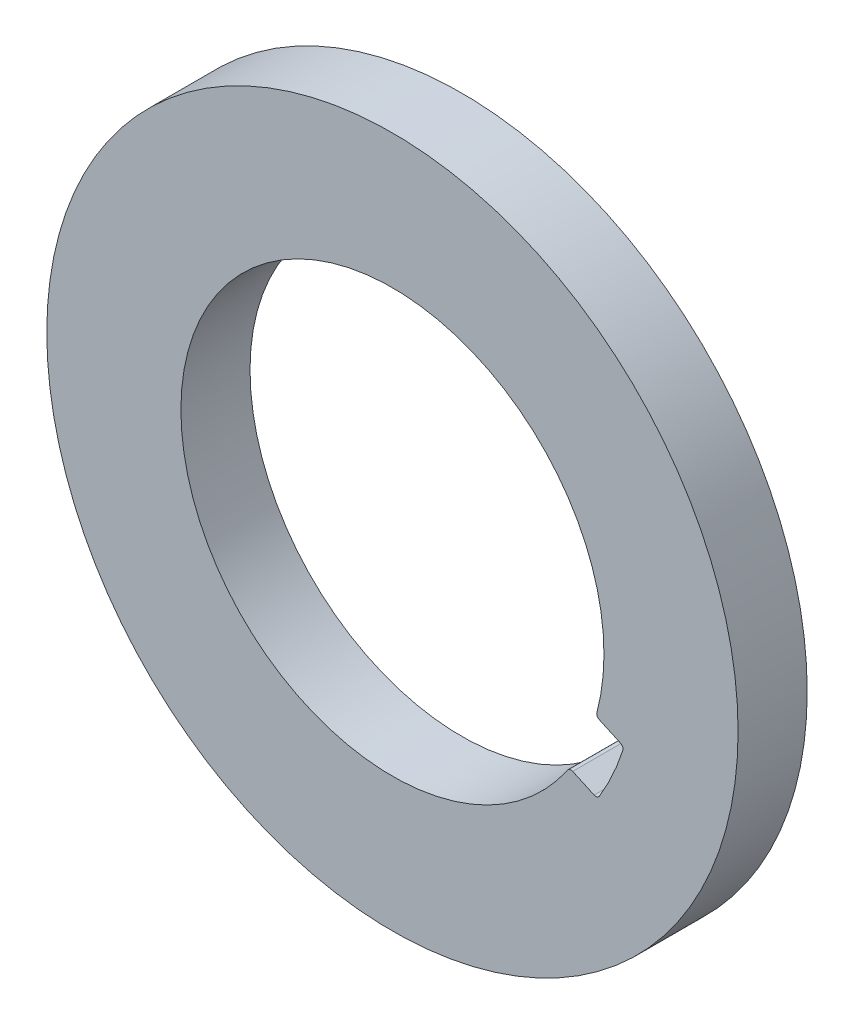
ISO-10303-21;
HEADER;
FILE_DESCRIPTION(('STEP AP214'),'2;1');
FILE_NAME('part.step','',(''),(''),'','','');
FILE_SCHEMA(('AUTOMOTIVE_DESIGN { 1 0 10303 214 1 1 1 1 }'));
ENDSEC;
DATA;
#1=APPLICATION_CONTEXT('core data for automotive mechanical design processes');
#2=APPLICATION_PROTOCOL_DEFINITION('international standard','automotive_design',2000,#1);
#3=PRODUCT_CONTEXT('',#1,'mechanical');
#4=PRODUCT('Part','Part','',(#3));
#5=PRODUCT_RELATED_PRODUCT_CATEGORY('part','',(#4));
#6=PRODUCT_DEFINITION_FORMATION('','',#4);
#7=PRODUCT_DEFINITION_CONTEXT('part definition',#1,'design');
#8=PRODUCT_DEFINITION('design','',#6,#7);
#9=PRODUCT_DEFINITION_SHAPE('','',#8);
#10=(LENGTH_UNIT() NAMED_UNIT(*) SI_UNIT(.MILLI.,.METRE.));
#11=(NAMED_UNIT(*) PLANE_ANGLE_UNIT() SI_UNIT($,.RADIAN.));
#12=(NAMED_UNIT(*) SI_UNIT($,.STERADIAN.) SOLID_ANGLE_UNIT());
#13=UNCERTAINTY_MEASURE_WITH_UNIT(LENGTH_MEASURE(1.E-05),#10,'distance_accuracy_value','');
#14=(GEOMETRIC_REPRESENTATION_CONTEXT(3) GLOBAL_UNCERTAINTY_ASSIGNED_CONTEXT((#13)) GLOBAL_UNIT_ASSIGNED_CONTEXT((#10,
#11,#12)) REPRESENTATION_CONTEXT('',''));
#15=CARTESIAN_POINT('',(0.,0.,0.));
#16=DIRECTION('',(0.,0.,1.));
#17=DIRECTION('',(1.,0.,0.));
#18=AXIS2_PLACEMENT_3D('',#15,#16,#17);
#19=CARTESIAN_POINT('',(0.,0.,5.));
#20=DIRECTION('',(0.,0.,1.));
#21=DIRECTION('',(1.,0.,0.));
#22=AXIS2_PLACEMENT_3D('',#19,#20,#21);
#23=PLANE('',#22);
#24=CARTESIAN_POINT('',(0.,0.,5.));
#25=DIRECTION('',(0.,0.,1.));
#26=DIRECTION('',(1.,0.,0.));
#27=AXIS2_PLACEMENT_3D('',#24,#25,#26);
#28=CIRCLE('',#27,25.);
#29=CARTESIAN_POINT('',(25.,0.,5.));
#30=VERTEX_POINT('',#29);
#31=EDGE_CURVE('E11',#30,#30,#28,.T.);
#32=ORIENTED_EDGE('',*,*,#31,.T.);
#33=EDGE_LOOP('',(#32));
#34=FACE_BOUND('',#33,.T.);
#35=CARTESIAN_POINT('',(0.,0.,5.));
#36=DIRECTION('',(0.,0.,1.));
#37=DIRECTION('',(-1.,0.,0.));
#38=AXIS2_PLACEMENT_3D('',#35,#36,#37);
#39=CIRCLE('',#38,15.3);
#40=CARTESIAN_POINT('',(14.7874090005765,-3.92715355565187,5.));
#41=VERTEX_POINT('',#40);
#42=CARTESIAN_POINT('',(12.665533257958,-8.58337155735204,5.));
#43=VERTEX_POINT('',#42);
#44=EDGE_CURVE('E106',#41,#43,#39,.T.);
#45=ORIENTED_EDGE('',*,*,#44,.F.);
#46=CARTESIAN_POINT('',(15.0773581966662,-4.00415656654701,5.));
#47=DIRECTION('',(0.,0.,-1.));
#48=DIRECTION('',(-1.,0.,0.));
#49=AXIS2_PLACEMENT_3D('',#46,#47,#48);
#50=CIRCLE('',#49,0.299999999999999);
#51=CARTESIAN_POINT('',(14.9530306261464,-4.27718157494119,5.));
#52=VERTEX_POINT('',#51);
#53=EDGE_CURVE('E98',#52,#41,#50,.T.);
#54=ORIENTED_EDGE('',*,*,#53,.F.);
#55=DIRECTION('',(-0.910083361313929,0.414425235066037,0.));
#56=VECTOR('',#55,1.);
#57=CARTESIAN_POINT('',(14.9530306261464,-4.27718157494119,5.));
#58=LINE('',#57,#56);
#59=CARTESIAN_POINT('',(16.5017580420231,-4.98242655651217,5.));
#60=VERTEX_POINT('',#59);
#61=EDGE_CURVE('E130',#60,#52,#58,.T.);
#62=ORIENTED_EDGE('',*,*,#61,.F.);
#63=CARTESIAN_POINT('',(16.3774304715033,-5.25545156490635,5.));
#64=DIRECTION('',(0.,0.,1.));
#65=DIRECTION('',(1.,0.,0.));
#66=AXIS2_PLACEMENT_3D('',#63,#64,#65);
#67=CIRCLE('',#66,0.300000000000004);
#68=CARTESIAN_POINT('',(16.6630833285644,-5.34711641778262,5.));
#69=VERTEX_POINT('',#68);
#70=EDGE_CURVE('E128',#69,#60,#67,.T.);
#71=ORIENTED_EDGE('',*,*,#70,.F.);
#72=CARTESIAN_POINT('',(0.,0.,5.));
#73=DIRECTION('',(0.,0.,1.));
#74=DIRECTION('',(-1.,0.,0.));
#75=AXIS2_PLACEMENT_3D('',#72,#73,#74);
#76=CIRCLE('',#75,17.5);
#77=CARTESIAN_POINT('',(14.9680088952146,-9.06690188061927,5.));
#78=VERTEX_POINT('',#77);
#79=EDGE_CURVE('E126',#78,#69,#76,.T.);
#80=ORIENTED_EDGE('',*,*,#79,.F.);
#81=CARTESIAN_POINT('',(14.7114144570109,-8.91146927695151,5.));
#82=DIRECTION('',(0.,0.,1.));
#83=DIRECTION('',(1.,0.,0.));
#84=AXIS2_PLACEMENT_3D('',#81,#82,#83);
#85=CIRCLE('',#84,0.300000000000001);
#86=CARTESIAN_POINT('',(14.5870093966954,-9.18445898548995,5.));
#87=VERTEX_POINT('',#86);
#88=EDGE_CURVE('E124',#87,#78,#85,.T.);
#89=ORIENTED_EDGE('',*,*,#88,.F.);
#90=DIRECTION('',(0.909965695128138,-0.414683534384915,0.));
#91=VECTOR('',#90,1.);
#92=CARTESIAN_POINT('',(13.0382821076452,-8.47868325189894,5.));
#93=LINE('',#92,#91);
#94=CARTESIAN_POINT('',(13.0382821076452,-8.47868325189894,5.));
#95=VERTEX_POINT('',#94);
#96=EDGE_CURVE('E120',#95,#87,#93,.T.);
#97=ORIENTED_EDGE('',*,*,#96,.F.);
#98=CARTESIAN_POINT('',(12.9138770473297,-8.75167296043738,5.));
#99=DIRECTION('',(0.,0.,-1.));
#100=DIRECTION('',(1.,0.,0.));
#101=AXIS2_PLACEMENT_3D('',#98,#99,#100);
#102=CIRCLE('',#101,0.299999999999998);
#103=EDGE_CURVE('E118',#43,#95,#102,.T.);
#104=ORIENTED_EDGE('',*,*,#103,.F.);
#105=EDGE_LOOP('',(#45,#54,#62,#71,#80,#89,#97,#104));
#106=FACE_BOUND('',#105,.T.);
#107=ADVANCED_FACE('F33',(#34,#106),#23,.T.);
#108=CARTESIAN_POINT('',(0.,0.,0.));
#109=DIRECTION('',(0.,0.,1.));
#110=DIRECTION('',(1.,0.,0.));
#111=AXIS2_PLACEMENT_3D('',#108,#109,#110);
#112=PLANE('',#111);
#113=CARTESIAN_POINT('',(0.,0.,0.));
#114=DIRECTION('',(0.,0.,1.));
#115=DIRECTION('',(1.,0.,0.));
#116=AXIS2_PLACEMENT_3D('',#113,#114,#115);
#117=CIRCLE('',#116,25.);
#118=CARTESIAN_POINT('',(25.,0.,0.));
#119=VERTEX_POINT('',#118);
#120=EDGE_CURVE('E37',#119,#119,#117,.T.);
#121=ORIENTED_EDGE('',*,*,#120,.F.);
#122=EDGE_LOOP('',(#121));
#123=FACE_BOUND('',#122,.T.);
#124=CARTESIAN_POINT('',(15.0773581966662,-4.00415656654701,0.));
#125=DIRECTION('',(0.,0.,-1.));
#126=DIRECTION('',(-1.,0.,0.));
#127=AXIS2_PLACEMENT_3D('',#124,#125,#126);
#128=CIRCLE('',#127,0.299999999999999);
#129=CARTESIAN_POINT('',(14.9530306261464,-4.27718157494119,0.));
#130=VERTEX_POINT('',#129);
#131=CARTESIAN_POINT('',(14.7874090005765,-3.92715355565187,0.));
#132=VERTEX_POINT('',#131);
#133=EDGE_CURVE('E56',#130,#132,#128,.T.);
#134=ORIENTED_EDGE('',*,*,#133,.T.);
#135=CARTESIAN_POINT('',(0.,0.,0.));
#136=DIRECTION('',(0.,0.,1.));
#137=DIRECTION('',(-1.,0.,0.));
#138=AXIS2_PLACEMENT_3D('',#135,#136,#137);
#139=CIRCLE('',#138,15.3);
#140=CARTESIAN_POINT('',(12.665533257958,-8.58337155735204,0.));
#141=VERTEX_POINT('',#140);
#142=EDGE_CURVE('E113',#132,#141,#139,.T.);
#143=ORIENTED_EDGE('',*,*,#142,.T.);
#144=CARTESIAN_POINT('',(12.9138770473297,-8.75167296043738,0.));
#145=DIRECTION('',(0.,0.,-1.));
#146=DIRECTION('',(1.,0.,0.));
#147=AXIS2_PLACEMENT_3D('',#144,#145,#146);
#148=CIRCLE('',#147,0.299999999999998);
#149=CARTESIAN_POINT('',(13.0382821076452,-8.47868325189894,0.));
#150=VERTEX_POINT('',#149);
#151=EDGE_CURVE('E134',#141,#150,#148,.T.);
#152=ORIENTED_EDGE('',*,*,#151,.T.);
#153=DIRECTION('',(0.909965695128138,-0.414683534384915,0.));
#154=VECTOR('',#153,1.);
#155=CARTESIAN_POINT('',(13.0382821076452,-8.47868325189894,0.));
#156=LINE('',#155,#154);
#157=CARTESIAN_POINT('',(14.5870093966954,-9.18445898548995,0.));
#158=VERTEX_POINT('',#157);
#159=EDGE_CURVE('E137',#150,#158,#156,.T.);
#160=ORIENTED_EDGE('',*,*,#159,.T.);
#161=CARTESIAN_POINT('',(14.7114144570109,-8.91146927695151,0.));
#162=DIRECTION('',(0.,0.,1.));
#163=DIRECTION('',(1.,0.,0.));
#164=AXIS2_PLACEMENT_3D('',#161,#162,#163);
#165=CIRCLE('',#164,0.300000000000001);
#166=CARTESIAN_POINT('',(14.9680088952146,-9.06690188061927,0.));
#167=VERTEX_POINT('',#166);
#168=EDGE_CURVE('E140',#158,#167,#165,.T.);
#169=ORIENTED_EDGE('',*,*,#168,.T.);
#170=CARTESIAN_POINT('',(0.,0.,0.));
#171=DIRECTION('',(0.,0.,1.));
#172=DIRECTION('',(-1.,0.,0.));
#173=AXIS2_PLACEMENT_3D('',#170,#171,#172);
#174=CIRCLE('',#173,17.5);
#175=CARTESIAN_POINT('',(16.6630833285644,-5.34711641778262,0.));
#176=VERTEX_POINT('',#175);
#177=EDGE_CURVE('E143',#167,#176,#174,.T.);
#178=ORIENTED_EDGE('',*,*,#177,.T.);
#179=CARTESIAN_POINT('',(16.3774304715033,-5.25545156490635,0.));
#180=DIRECTION('',(0.,0.,1.));
#181=DIRECTION('',(1.,0.,0.));
#182=AXIS2_PLACEMENT_3D('',#179,#180,#181);
#183=CIRCLE('',#182,0.300000000000004);
#184=CARTESIAN_POINT('',(16.5017580420231,-4.98242655651217,0.));
#185=VERTEX_POINT('',#184);
#186=EDGE_CURVE('E146',#176,#185,#183,.T.);
#187=ORIENTED_EDGE('',*,*,#186,.T.);
#188=DIRECTION('',(-0.910083361313929,0.414425235066037,0.));
#189=VECTOR('',#188,1.);
#190=CARTESIAN_POINT('',(14.9530306261464,-4.27718157494119,0.));
#191=LINE('',#190,#189);
#192=EDGE_CURVE('E107',#185,#130,#191,.T.);
#193=ORIENTED_EDGE('',*,*,#192,.T.);
#194=EDGE_LOOP('',(#134,#143,#152,#160,#169,#178,#187,#193));
#195=FACE_BOUND('',#194,.T.);
#196=ADVANCED_FACE('F167',(#123,#195),#112,.F.);
#197=CARTESIAN_POINT('',(0.,0.,5.));
#198=DIRECTION('',(0.,0.,-1.));
#199=DIRECTION('',(-1.,0.,0.));
#200=AXIS2_PLACEMENT_3D('',#197,#198,#199);
#201=CYLINDRICAL_SURFACE('',#200,25.);
#202=ORIENTED_EDGE('',*,*,#31,.F.);
#203=EDGE_LOOP('',(#202));
#204=FACE_BOUND('',#203,.T.);
#205=ORIENTED_EDGE('',*,*,#120,.T.);
#206=EDGE_LOOP('',(#205));
#207=FACE_BOUND('',#206,.T.);
#208=ADVANCED_FACE('F35',(#204,#207),#201,.T.);
#209=CARTESIAN_POINT('',(15.0773581966662,-4.00415656654701,5.));
#210=DIRECTION('',(0.,0.,-1.));
#211=DIRECTION('',(-1.,0.,0.));
#212=AXIS2_PLACEMENT_3D('',#209,#210,#211);
#213=CYLINDRICAL_SURFACE('',#212,0.299999999999999);
#214=ORIENTED_EDGE('',*,*,#133,.F.);
#215=DIRECTION('',(0.,0.,-1.));
#216=VECTOR('',#215,1.);
#217=CARTESIAN_POINT('',(14.9530306261464,-4.27718157494119,5.));
#218=LINE('',#217,#216);
#219=EDGE_CURVE('E102',#52,#130,#218,.T.);
#220=ORIENTED_EDGE('',*,*,#219,.F.);
#221=ORIENTED_EDGE('',*,*,#53,.T.);
#222=DIRECTION('',(0.,0.,-1.));
#223=VECTOR('',#222,1.);
#224=CARTESIAN_POINT('',(14.7874090005765,-3.92715355565187,5.));
#225=LINE('',#224,#223);
#226=EDGE_CURVE('E101',#41,#132,#225,.T.);
#227=ORIENTED_EDGE('',*,*,#226,.T.);
#228=EDGE_LOOP('',(#214,#220,#221,#227));
#229=FACE_BOUND('',#228,.T.);
#230=ADVANCED_FACE('F100',(#229),#213,.T.);
#231=CARTESIAN_POINT('',(0.,0.,5.));
#232=DIRECTION('',(0.,0.,-1.));
#233=DIRECTION('',(-1.,0.,0.));
#234=AXIS2_PLACEMENT_3D('',#231,#232,#233);
#235=CYLINDRICAL_SURFACE('',#234,15.3);
#236=ORIENTED_EDGE('',*,*,#142,.F.);
#237=ORIENTED_EDGE('',*,*,#226,.F.);
#238=ORIENTED_EDGE('',*,*,#44,.T.);
#239=DIRECTION('',(0.,0.,-1.));
#240=VECTOR('',#239,1.);
#241=CARTESIAN_POINT('',(12.665533257958,-8.58337155735204,5.));
#242=LINE('',#241,#240);
#243=EDGE_CURVE('E114',#43,#141,#242,.T.);
#244=ORIENTED_EDGE('',*,*,#243,.T.);
#245=EDGE_LOOP('',(#236,#237,#238,#244));
#246=FACE_BOUND('',#245,.T.);
#247=ADVANCED_FACE('F110',(#246),#235,.F.);
#248=CARTESIAN_POINT('',(12.9138770473297,-8.75167296043738,5.));
#249=DIRECTION('',(0.,0.,-1.));
#250=DIRECTION('',(-1.,0.,0.));
#251=AXIS2_PLACEMENT_3D('',#248,#249,#250);
#252=CYLINDRICAL_SURFACE('',#251,0.299999999999998);
#253=ORIENTED_EDGE('',*,*,#151,.F.);
#254=ORIENTED_EDGE('',*,*,#243,.F.);
#255=ORIENTED_EDGE('',*,*,#103,.T.);
#256=DIRECTION('',(0.,0.,-1.));
#257=VECTOR('',#256,1.);
#258=CARTESIAN_POINT('',(13.0382821076452,-8.47868325189894,5.));
#259=LINE('',#258,#257);
#260=EDGE_CURVE('E159',#95,#150,#259,.T.);
#261=ORIENTED_EDGE('',*,*,#260,.T.);
#262=EDGE_LOOP('',(#253,#254,#255,#261));
#263=FACE_BOUND('',#262,.T.);
#264=ADVANCED_FACE('F163',(#263),#252,.T.);
#265=CARTESIAN_POINT('',(13.0382821076452,-8.47868325189894,5.));
#266=DIRECTION('',(0.414683534384915,0.909965695128138,0.));
#267=DIRECTION('',(-0.909965695128138,0.414683534384915,0.));
#268=AXIS2_PLACEMENT_3D('',#265,#266,#267);
#269=PLANE('',#268);
#270=ORIENTED_EDGE('',*,*,#159,.F.);
#271=ORIENTED_EDGE('',*,*,#260,.F.);
#272=ORIENTED_EDGE('',*,*,#96,.T.);
#273=DIRECTION('',(0.,0.,-1.));
#274=VECTOR('',#273,1.);
#275=CARTESIAN_POINT('',(14.5870093966954,-9.18445898548995,5.));
#276=LINE('',#275,#274);
#277=EDGE_CURVE('E157',#87,#158,#276,.T.);
#278=ORIENTED_EDGE('',*,*,#277,.T.);
#279=EDGE_LOOP('',(#270,#271,#272,#278));
#280=FACE_BOUND('',#279,.T.);
#281=ADVANCED_FACE('F185',(#280),#269,.T.);
#282=CARTESIAN_POINT('',(14.7114144570109,-8.91146927695151,5.));
#283=DIRECTION('',(0.,0.,-1.));
#284=DIRECTION('',(-1.,0.,0.));
#285=AXIS2_PLACEMENT_3D('',#282,#283,#284);
#286=CYLINDRICAL_SURFACE('',#285,0.300000000000001);
#287=ORIENTED_EDGE('',*,*,#168,.F.);
#288=ORIENTED_EDGE('',*,*,#277,.F.);
#289=ORIENTED_EDGE('',*,*,#88,.T.);
#290=DIRECTION('',(0.,0.,-1.));
#291=VECTOR('',#290,1.);
#292=CARTESIAN_POINT('',(14.9680088952146,-9.06690188061927,5.));
#293=LINE('',#292,#291);
#294=EDGE_CURVE('E155',#78,#167,#293,.T.);
#295=ORIENTED_EDGE('',*,*,#294,.T.);
#296=EDGE_LOOP('',(#287,#288,#289,#295));
#297=FACE_BOUND('',#296,.T.);
#298=ADVANCED_FACE('F182',(#297),#286,.F.);
#299=CARTESIAN_POINT('',(0.,0.,5.));
#300=DIRECTION('',(0.,0.,-1.));
#301=DIRECTION('',(-1.,0.,0.));
#302=AXIS2_PLACEMENT_3D('',#299,#300,#301);
#303=CYLINDRICAL_SURFACE('',#302,17.5);
#304=ORIENTED_EDGE('',*,*,#177,.F.);
#305=ORIENTED_EDGE('',*,*,#294,.F.);
#306=ORIENTED_EDGE('',*,*,#79,.T.);
#307=DIRECTION('',(0.,0.,-1.));
#308=VECTOR('',#307,1.);
#309=CARTESIAN_POINT('',(16.6630833285644,-5.34711641778262,5.));
#310=LINE('',#309,#308);
#311=EDGE_CURVE('E153',#69,#176,#310,.T.);
#312=ORIENTED_EDGE('',*,*,#311,.T.);
#313=EDGE_LOOP('',(#304,#305,#306,#312));
#314=FACE_BOUND('',#313,.T.);
#315=ADVANCED_FACE('F178',(#314),#303,.F.);
#316=CARTESIAN_POINT('',(16.3774304715033,-5.25545156490635,5.));
#317=DIRECTION('',(0.,0.,-1.));
#318=DIRECTION('',(-1.,0.,0.));
#319=AXIS2_PLACEMENT_3D('',#316,#317,#318);
#320=CYLINDRICAL_SURFACE('',#319,0.300000000000004);
#321=ORIENTED_EDGE('',*,*,#186,.F.);
#322=ORIENTED_EDGE('',*,*,#311,.F.);
#323=ORIENTED_EDGE('',*,*,#70,.T.);
#324=DIRECTION('',(0.,0.,-1.));
#325=VECTOR('',#324,1.);
#326=CARTESIAN_POINT('',(16.5017580420231,-4.98242655651217,5.));
#327=LINE('',#326,#325);
#328=EDGE_CURVE('E48',#60,#185,#327,.T.);
#329=ORIENTED_EDGE('',*,*,#328,.T.);
#330=EDGE_LOOP('',(#321,#322,#323,#329));
#331=FACE_BOUND('',#330,.T.);
#332=ADVANCED_FACE('F175',(#331),#320,.F.);
#333=CARTESIAN_POINT('',(14.9530306261464,-4.27718157494119,5.));
#334=DIRECTION('',(-0.414425235066037,-0.910083361313929,0.));
#335=DIRECTION('',(0.910083361313929,-0.414425235066037,0.));
#336=AXIS2_PLACEMENT_3D('',#333,#334,#335);
#337=PLANE('',#336);
#338=ORIENTED_EDGE('',*,*,#192,.F.);
#339=ORIENTED_EDGE('',*,*,#328,.F.);
#340=ORIENTED_EDGE('',*,*,#61,.T.);
#341=ORIENTED_EDGE('',*,*,#219,.T.);
#342=EDGE_LOOP('',(#338,#339,#340,#341));
#343=FACE_BOUND('',#342,.T.);
#344=ADVANCED_FACE('F169',(#343),#337,.T.);
#345=CLOSED_SHELL('',(#107,#196,#208,#230,#247,#264,#281,#298,#315,#332,#344));
#346=MANIFOLD_SOLID_BREP('B2',#345);
#347=ADVANCED_BREP_SHAPE_REPRESENTATION('',(#18,#346),#14);
#348=SHAPE_DEFINITION_REPRESENTATION(#9,#347);
ENDSEC;
END-ISO-10303-21;
